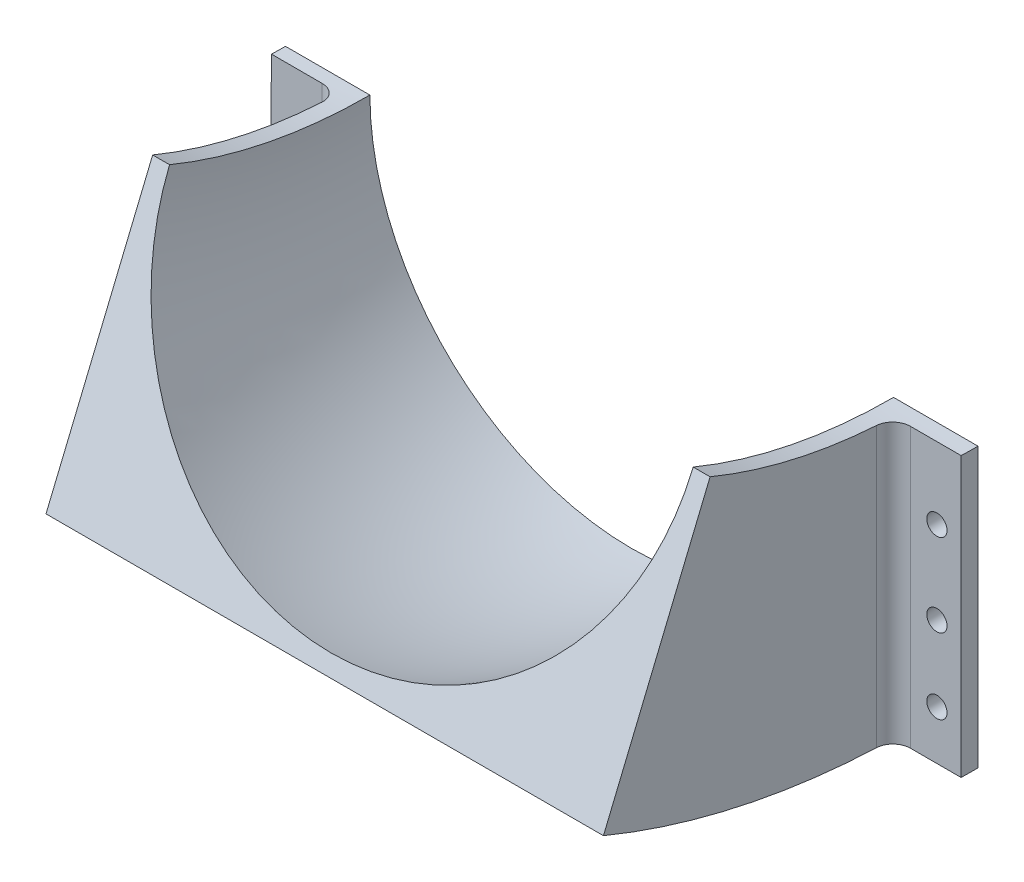
ISO-10303-21;
HEADER;
FILE_DESCRIPTION(('STEP AP214'),'2;1');
FILE_NAME('part.step','',(''),(''),'','','');
FILE_SCHEMA(('AUTOMOTIVE_DESIGN { 1 0 10303 214 1 1 1 1 }'));
ENDSEC;
DATA;
#1=APPLICATION_CONTEXT('core data for automotive mechanical design processes');
#2=APPLICATION_PROTOCOL_DEFINITION('international standard','automotive_design',2000,#1);
#3=PRODUCT_CONTEXT('',#1,'mechanical');
#4=PRODUCT('Part','Part','',(#3));
#5=PRODUCT_RELATED_PRODUCT_CATEGORY('part','',(#4));
#6=PRODUCT_DEFINITION_FORMATION('','',#4);
#7=PRODUCT_DEFINITION_CONTEXT('part definition',#1,'design');
#8=PRODUCT_DEFINITION('design','',#6,#7);
#9=PRODUCT_DEFINITION_SHAPE('','',#8);
#10=(LENGTH_UNIT() NAMED_UNIT(*) SI_UNIT(.MILLI.,.METRE.));
#11=(NAMED_UNIT(*) PLANE_ANGLE_UNIT() SI_UNIT($,.RADIAN.));
#12=(NAMED_UNIT(*) SI_UNIT($,.STERADIAN.) SOLID_ANGLE_UNIT());
#13=UNCERTAINTY_MEASURE_WITH_UNIT(LENGTH_MEASURE(1.E-05),#10,'distance_accuracy_value','');
#14=(GEOMETRIC_REPRESENTATION_CONTEXT(3) GLOBAL_UNCERTAINTY_ASSIGNED_CONTEXT((#13)) GLOBAL_UNIT_ASSIGNED_CONTEXT((#10,
#11,#12)) REPRESENTATION_CONTEXT('',''));
#15=CARTESIAN_POINT('',(0.,0.,0.));
#16=DIRECTION('',(0.,0.,1.));
#17=DIRECTION('',(1.,0.,0.));
#18=AXIS2_PLACEMENT_3D('',#15,#16,#17);
#19=CARTESIAN_POINT('',(52.4001999999994,-90.9328429874235,37.6656168305343));
#20=DIRECTION('',(-1.,0.,0.));
#21=DIRECTION('',(0.,0.,1.));
#22=AXIS2_PLACEMENT_3D('',#19,#20,#21);
#23=PLANE('',#22);
#24=DIRECTION('',(0.,-0.0105254294375171,-0.999944606133338));
#25=VECTOR('',#24,1.);
#26=CARTESIAN_POINT('',(52.4002000000002,-150.8252,0.));
#27=LINE('',#26,#25);
#28=CARTESIAN_POINT('',(52.4002000000002,-150.791781761536,3.17482412447336));
#29=VERTEX_POINT('',#28);
#30=CARTESIAN_POINT('',(52.4002,-150.8252,0.));
#31=VERTEX_POINT('',#30);
#32=EDGE_CURVE('E144',#29,#31,#27,.T.);
#33=ORIENTED_EDGE('',*,*,#32,.F.);
#34=CARTESIAN_POINT('',(52.4001999999987,4.33410518585465E-13,4.43591302579083E-13));
#35=DIRECTION('',(1.,0.,0.));
#36=DIRECTION('',(0.,0.,-1.));
#37=AXIS2_PLACEMENT_3D('',#34,#35,#36);
#38=CIRCLE('',#37,150.8252);
#39=EDGE_CURVE('E228',#29,#31,#38,.T.);
#40=ORIENTED_EDGE('',*,*,#39,.T.);
#41=EDGE_LOOP('',(#33,#40));
#42=FACE_BOUND('',#41,.T.);
#43=ADVANCED_FACE('F32',(#42),#23,.F.);
#44=CARTESIAN_POINT('',(52.4001999999994,-139.344315266921,57.7183052231515));
#45=VERTEX_POINT('',#44);
#46=CARTESIAN_POINT('',(52.4001999999999,-150.691475169063,6.34982412447336));
#47=VERTEX_POINT('',#46);
#48=EDGE_CURVE('E313',#45,#47,#38,.T.);
#49=ORIENTED_EDGE('',*,*,#48,.T.);
#50=DIRECTION('',(0.,-1.,0.));
#51=VECTOR('',#50,1.);
#52=CARTESIAN_POINT('',(52.4001999999997,-98.3737826698693,6.34982412447336));
#53=LINE('',#52,#51);
#54=CARTESIAN_POINT('',(52.4001999999999,-98.2199590642771,6.34982412447336));
#55=VERTEX_POINT('',#54);
#56=EDGE_CURVE('E171',#47,#55,#53,.F.);
#57=ORIENTED_EDGE('',*,*,#56,.T.);
#58=CARTESIAN_POINT('',(52.4001999999992,4.33410518585468E-13,4.43591302579087E-13));
#59=DIRECTION('',(1.,0.,0.));
#60=DIRECTION('',(0.,0.,-1.));
#61=AXIS2_PLACEMENT_3D('',#58,#59,#60);
#62=CIRCLE('',#61,98.4250000000005);
#63=CARTESIAN_POINT('',(52.4001999999996,-90.9328429874235,37.6656168305343));
#64=VERTEX_POINT('',#63);
#65=EDGE_CURVE('E158',#64,#55,#62,.T.);
#66=ORIENTED_EDGE('',*,*,#65,.F.);
#67=DIRECTION('',(0.,0.923879532511286,-0.382683432365091));
#68=VECTOR('',#67,1.);
#69=CARTESIAN_POINT('',(52.4001999999996,-90.9328429874235,37.6656168305343));
#70=LINE('',#69,#68);
#71=EDGE_CURVE('E271',#45,#64,#70,.T.);
#72=ORIENTED_EDGE('',*,*,#71,.F.);
#73=EDGE_LOOP('',(#49,#57,#66,#72));
#74=FACE_BOUND('',#73,.T.);
#75=ADVANCED_FACE('F212',(#74),#23,.F.);
#76=CARTESIAN_POINT('',(-52.4002000000006,-90.9328429874233,37.6656168305338));
#77=DIRECTION('',(1.,0.,0.));
#78=DIRECTION('',(0.,0.,-1.));
#79=AXIS2_PLACEMENT_3D('',#76,#77,#78);
#80=PLANE('',#79);
#81=CARTESIAN_POINT('',(-52.4002000000008,-4.33410518585482E-13,-4.43591302579101E-13));
#82=DIRECTION('',(1.,0.,0.));
#83=DIRECTION('',(0.,0.,-1.));
#84=AXIS2_PLACEMENT_3D('',#81,#82,#83);
#85=CIRCLE('',#84,98.4249999999996);
#86=CARTESIAN_POINT('',(-52.4002000000004,-90.9328429874233,37.6656168305338));
#87=VERTEX_POINT('',#86);
#88=CARTESIAN_POINT('',(-52.4002,-98.2541375915305,5.79698810975075));
#89=VERTEX_POINT('',#88);
#90=EDGE_CURVE('E279',#87,#89,#85,.T.);
#91=ORIENTED_EDGE('',*,*,#90,.T.);
#92=DIRECTION('',(0.,0.999944606133338,-0.0105254294375171));
#93=VECTOR('',#92,1.);
#94=CARTESIAN_POINT('',(-52.4001999999998,-150.758363523072,6.34964824894671));
#95=LINE('',#94,#93);
#96=CARTESIAN_POINT('',(-52.4002,-150.691512229022,6.34894457138896));
#97=VERTEX_POINT('',#96);
#98=EDGE_CURVE('E166',#89,#97,#95,.F.);
#99=ORIENTED_EDGE('',*,*,#98,.T.);
#100=CARTESIAN_POINT('',(-52.4002000000012,-4.33410518585485E-13,-4.43591302579104E-13));
#101=DIRECTION('',(1.,0.,0.));
#102=DIRECTION('',(0.,0.,-1.));
#103=AXIS2_PLACEMENT_3D('',#100,#101,#102);
#104=CIRCLE('',#103,150.8252);
#105=CARTESIAN_POINT('',(-52.4002000000006,-139.344315266921,57.7183052231511));
#106=VERTEX_POINT('',#105);
#107=EDGE_CURVE('E287',#106,#97,#104,.T.);
#108=ORIENTED_EDGE('',*,*,#107,.F.);
#109=DIRECTION('',(0.,-0.923879532511286,0.382683432365091));
#110=VECTOR('',#109,1.);
#111=CARTESIAN_POINT('',(-52.4002000000004,-90.9328429874233,37.6656168305338));
#112=LINE('',#111,#110);
#113=EDGE_CURVE('E265',#87,#106,#112,.T.);
#114=ORIENTED_EDGE('',*,*,#113,.F.);
#115=EDGE_LOOP('',(#91,#99,#108,#114));
#116=FACE_BOUND('',#115,.T.);
#117=ADVANCED_FACE('F209',(#116),#80,.F.);
#118=CARTESIAN_POINT('',(-8.08335934173403E-13,0.,0.));
#119=DIRECTION('',(1.,0.,0.));
#120=DIRECTION('',(0.,0.,-1.));
#121=AXIS2_PLACEMENT_3D('',#118,#119,#120);
#122=TOROIDAL_SURFACE('',#121,98.425,49.2252);
#123=CARTESIAN_POINT('',(49.2251999999992,4.07149580716741E-13,4.16713497042302E-13));
#124=DIRECTION('',(1.,0.,0.));
#125=DIRECTION('',(0.,0.,-1.));
#126=AXIS2_PLACEMENT_3D('',#123,#124,#125);
#127=CIRCLE('',#126,98.4250000000004);
#128=CARTESIAN_POINT('',(49.2251999999996,-90.9328429874235,37.6656168305342));
#129=VERTEX_POINT('',#128);
#130=CARTESIAN_POINT('',(49.2252,-98.425,0.));
#131=VERTEX_POINT('',#130);
#132=EDGE_CURVE('E167',#129,#131,#127,.T.);
#133=ORIENTED_EDGE('',*,*,#132,.T.);
#134=CARTESIAN_POINT('',(0.,-98.425,0.));
#135=DIRECTION('',(0.,0.,-1.));
#136=DIRECTION('',(1.,0.,0.));
#137=AXIS2_PLACEMENT_3D('',#134,#135,#136);
#138=CIRCLE('',#137,49.2252);
#139=CARTESIAN_POINT('',(-49.2252,-98.425,0.));
#140=VERTEX_POINT('',#139);
#141=EDGE_CURVE('E249',#131,#140,#138,.T.);
#142=ORIENTED_EDGE('',*,*,#141,.T.);
#143=CARTESIAN_POINT('',(-49.2252000000008,-4.07149580716755E-13,-4.16713497042316E-13));
#144=DIRECTION('',(1.,0.,0.));
#145=DIRECTION('',(0.,0.,-1.));
#146=AXIS2_PLACEMENT_3D('',#143,#144,#145);
#147=CIRCLE('',#146,98.4249999999996);
#148=CARTESIAN_POINT('',(-49.2252000000004,-90.9328429874233,37.6656168305339));
#149=VERTEX_POINT('',#148);
#150=EDGE_CURVE('E277',#149,#140,#147,.T.);
#151=ORIENTED_EDGE('',*,*,#150,.F.);
#152=CARTESIAN_POINT('',(-3.78124512131155E-13,-90.9328429874234,37.665616830534));
#153=DIRECTION('',(0.,-0.382683432365091,-0.923879532511286));
#154=DIRECTION('',(1.,0.,0.));
#155=AXIS2_PLACEMENT_3D('',#152,#153,#154);
#156=CIRCLE('',#155,49.2252);
#157=EDGE_CURVE('E259',#129,#149,#156,.T.);
#158=ORIENTED_EDGE('',*,*,#157,.F.);
#159=EDGE_LOOP('',(#133,#142,#151,#158));
#160=FACE_BOUND('',#159,.T.);
#161=ADVANCED_FACE('F200',(#160),#122,.F.);
#162=CARTESIAN_POINT('',(-38.048924234204,-3.14708798515383E-13,-3.22101287071114E-13));
#163=DIRECTION('',(1.,0.,0.));
#164=DIRECTION('',(0.,0.,-1.));
#165=AXIS2_PLACEMENT_3D('',#162,#163,#164);
#166=CYLINDRICAL_SURFACE('',#165,98.4250000000004);
#167=ORIENTED_EDGE('',*,*,#65,.T.);
#168=CARTESIAN_POINT('',(52.4001999999997,-98.2199590642771,6.34982412447336));
#169=CARTESIAN_POINT('',(52.400191499142,-98.2257329040307,6.26053191378045));
#170=CARTESIAN_POINT('',(52.4039668015081,-98.2313824049752,6.17123535133689));
#171=CARTESIAN_POINT('',(52.4190234059374,-98.2424007766746,5.9932630885812));
#172=CARTESIAN_POINT('',(52.4303044292155,-98.2477696578446,5.90458736533286));
#173=CARTESIAN_POINT('',(52.4603005356074,-98.2581916778865,5.72854031558916));
#174=CARTESIAN_POINT('',(52.4790104891243,-98.2632450318461,5.64116813211565));
#175=CARTESIAN_POINT('',(52.5237170018949,-98.2730159174548,5.46831574734498));
#176=CARTESIAN_POINT('',(52.5497134504481,-98.2777334542045,5.38283551732551));
#177=CARTESIAN_POINT('',(52.6384322243503,-98.2913605041457,5.13005134228879));
#178=CARTESIAN_POINT('',(52.7118946055312,-98.2997481088688,4.96634183073719));
#179=CARTESIAN_POINT('',(52.8852766000394,-98.3150474677564,4.65367170948396));
#180=CARTESIAN_POINT('',(52.9851908324749,-98.3219595215647,4.50470810859559));
#181=CARTESIAN_POINT('',(53.2085332261674,-98.3343403186156,4.22582642067313));
#182=CARTESIAN_POINT('',(53.3319295896855,-98.3398109900532,4.09588299414776));
#183=CARTESIAN_POINT('',(53.5988501278835,-98.349410607911,3.85852504230684));
#184=CARTESIAN_POINT('',(53.7423782846394,-98.3535392883477,3.75111498461524));
#185=CARTESIAN_POINT('',(54.045327855363,-98.360570312984,3.56199541466849));
#186=CARTESIAN_POINT('',(54.2047370067462,-98.3634735944477,3.48026627226839));
#187=CARTESIAN_POINT('',(54.534992993334,-98.3681748548551,3.34476112101959));
#188=CARTESIAN_POINT('',(54.7058329830998,-98.3699734888701,3.29096854832432));
#189=CARTESIAN_POINT('',(54.9939716379102,-98.3721117482247,3.22628403907093));
#190=CARTESIAN_POINT('',(55.109453615333,-98.3727404928343,3.20699819506851));
#191=CARTESIAN_POINT('',(55.3416742245253,-98.373574671572,3.18126998092252));
#192=CARTESIAN_POINT('',(55.4584108338399,-98.3737807069024,3.17480937039736));
#193=CARTESIAN_POINT('',(55.5751999999997,-98.3737826698692,3.17482412447339));
#194=B_SPLINE_CURVE_WITH_KNOTS('',3,(#168,#169,#170,#171,#172,#173,#174,#175,#176,#177,#178,
#179,#180,#181,#182,#183,#184,#185,#186,#187,#188,#189,#190,#191,#192,#193),.UNSPECIFIED.,.F.,
.F.,(4,2,2,2,2,2,2,2,2,2,2,2,4),(0.,0.268349604683924,0.536689242612577,0.804843916213137,
1.07299451608083,1.60910883059716,2.1451141712846,2.68039879309688,3.21578944410519,
3.75076984853317,4.2854326950333,4.63601806405564,4.9861044631751),.UNSPECIFIED.);
#195=CARTESIAN_POINT('',(55.5751999999997,-98.3737826698692,3.17482412447339));
#196=VERTEX_POINT('',#195);
#197=EDGE_CURVE('E42',#55,#196,#194,.T.);
#198=ORIENTED_EDGE('',*,*,#197,.T.);
#199=DIRECTION('',(-1.,0.,0.));
#200=VECTOR('',#199,1.);
#201=CARTESIAN_POINT('',(65.1001999999997,-98.3737826698691,3.17482412447347));
#202=LINE('',#201,#200);
#203=CARTESIAN_POINT('',(65.1001999999997,-98.3737826698691,3.17482412447347));
#204=VERTEX_POINT('',#203);
#205=EDGE_CURVE('E128',#204,#196,#202,.T.);
#206=ORIENTED_EDGE('',*,*,#205,.F.);
#207=CARTESIAN_POINT('',(65.1001999999989,5.38454270060376E-13,5.51102524726224E-13));
#208=DIRECTION('',(-1.,0.,0.));
#209=DIRECTION('',(0.,0.,-1.));
#210=AXIS2_PLACEMENT_3D('',#207,#208,#209);
#211=CIRCLE('',#210,98.4250000000005);
#212=CARTESIAN_POINT('',(65.1001999999998,-98.4249999999999,1.07511222147137E-13));
#213=VERTEX_POINT('',#212);
#214=EDGE_CURVE('E135',#213,#204,#211,.T.);
#215=ORIENTED_EDGE('',*,*,#214,.F.);
#216=DIRECTION('',(-1.,0.,0.));
#217=VECTOR('',#216,1.);
#218=CARTESIAN_POINT('',(49.2252,-98.425,0.));
#219=LINE('',#218,#217);
#220=EDGE_CURVE('E257',#213,#131,#219,.T.);
#221=ORIENTED_EDGE('',*,*,#220,.T.);
#222=ORIENTED_EDGE('',*,*,#132,.F.);
#223=DIRECTION('',(-1.,0.,0.));
#224=VECTOR('',#223,1.);
#225=CARTESIAN_POINT('',(49.2251999999996,-90.9328429874235,37.6656168305342));
#226=LINE('',#225,#224);
#227=EDGE_CURVE('E274',#64,#129,#226,.T.);
#228=ORIENTED_EDGE('',*,*,#227,.F.);
#229=EDGE_LOOP('',(#167,#198,#206,#215,#221,#222,#228));
#230=FACE_BOUND('',#229,.T.);
#231=ADVANCED_FACE('F147',(#230),#166,.F.);
#232=CARTESIAN_POINT('',(-38.048924234204,-3.14708798515383E-13,-3.22101287071114E-13));
#233=DIRECTION('',(1.,0.,0.));
#234=DIRECTION('',(0.,0.,-1.));
#235=AXIS2_PLACEMENT_3D('',#232,#233,#234);
#236=CYLINDRICAL_SURFACE('',#235,150.8252);
#237=ORIENTED_EDGE('',*,*,#107,.T.);
#238=CARTESIAN_POINT('',(-52.4001999999998,-150.691512229022,6.34894457138896));
#239=CARTESIAN_POINT('',(-52.4001914501951,-150.695273322151,6.25969374569486));
#240=CARTESIAN_POINT('',(-52.4039662225406,-150.698953433331,6.17044345448695));
#241=CARTESIAN_POINT('',(-52.4190175793959,-150.706130833941,5.99257418114129));
#242=CARTESIAN_POINT('',(-52.4302938259575,-150.709628131598,5.90395517074554));
#243=CARTESIAN_POINT('',(-52.4602721942552,-150.716416872689,5.72803577455502));
#244=CARTESIAN_POINT('',(-52.4789688049355,-150.719708466801,5.64073445995302));
#245=CARTESIAN_POINT('',(-52.5236374448059,-150.726072953555,5.46803162953788));
#246=CARTESIAN_POINT('',(-52.54960937903,-150.729145849051,5.38263008894237));
#247=CARTESIAN_POINT('',(-52.6382309583886,-150.738022078061,5.13009772180996));
#248=CARTESIAN_POINT('',(-52.7115982047064,-150.743485601129,4.96657011748419));
#249=CARTESIAN_POINT('',(-52.8847173002034,-150.753452224235,4.65425636689482));
#250=CARTESIAN_POINT('',(-52.984464330481,-150.757955499414,4.50546753505674));
#251=CARTESIAN_POINT('',(-53.2075111852032,-150.766027102767,4.22675645845941));
#252=CARTESIAN_POINT('',(-53.3308033020946,-150.769595735995,4.09682806411128));
#253=CARTESIAN_POINT('',(-53.5974872147325,-150.77585845353,3.85948250153951));
#254=CARTESIAN_POINT('',(-53.7408829590143,-150.77855236569,3.75206976596224));
#255=CARTESIAN_POINT('',(-54.0436749126128,-150.783142902094,3.56283060148352));
#256=CARTESIAN_POINT('',(-54.2030722156421,-150.785039471794,3.48100592311064));
#257=CARTESIAN_POINT('',(-54.5333134910483,-150.788111203075,3.34531172938945));
#258=CARTESIAN_POINT('',(-54.704150690599,-150.789286787388,3.29142583564878));
#259=CARTESIAN_POINT('',(-54.9925605363774,-150.790686499879,3.22652749378016));
#260=CARTESIAN_POINT('',(-55.108319286784,-150.791098636654,3.20715048278115));
#261=CARTESIAN_POINT('',(-55.3411025217112,-150.791645424796,3.18130047143857));
#262=CARTESIAN_POINT('',(-55.4581249752487,-150.791780469401,3.17480918466213));
#263=CARTESIAN_POINT('',(-55.5751999999998,-150.791781761536,3.17482412447334));
#264=B_SPLINE_CURVE_WITH_KNOTS('',3,(#238,#239,#240,#241,#242,#243,#244,#245,#246,#247,#248,
#249,#250,#251,#252,#253,#254,#255,#256,#257,#258,#259,#260,#261,#262,#263),.UNSPECIFIED.,.F.,
.F.,(4,2,2,2,2,2,2,2,2,2,2,2,4),(0.,0.267903201146717,0.535794333830029,0.803486876733843,
1.07117592556573,1.60634640907749,2.14141919828247,2.6763171291607,3.21132026642892,
3.74635999629544,4.28108571726295,4.63252763386337,4.98347045344798),.UNSPECIFIED.);
#265=CARTESIAN_POINT('',(-55.5751999999998,-150.791781761536,3.17482412447329));
#266=VERTEX_POINT('',#265);
#267=EDGE_CURVE('E179',#97,#266,#264,.T.);
#268=ORIENTED_EDGE('',*,*,#267,.T.);
#269=DIRECTION('',(1.,0.,0.));
#270=VECTOR('',#269,1.);
#271=CARTESIAN_POINT('',(-65.1001999999998,-150.791781761536,3.1748241244732));
#272=LINE('',#271,#270);
#273=CARTESIAN_POINT('',(-65.1001999999998,-150.791781761536,3.1748241244732));
#274=VERTEX_POINT('',#273);
#275=EDGE_CURVE('E253',#274,#266,#272,.T.);
#276=ORIENTED_EDGE('',*,*,#275,.F.);
#277=CARTESIAN_POINT('',(-65.100200000001,-5.38454270060393E-13,-5.51102524726241E-13));
#278=DIRECTION('',(-1.,0.,0.));
#279=DIRECTION('',(0.,0.,1.));
#280=AXIS2_PLACEMENT_3D('',#277,#278,#279);
#281=CIRCLE('',#280,150.8252);
#282=CARTESIAN_POINT('',(-65.1001999999997,-150.8252,-1.07511222147137E-13));
#283=VERTEX_POINT('',#282);
#284=EDGE_CURVE('E244',#283,#274,#281,.T.);
#285=ORIENTED_EDGE('',*,*,#284,.F.);
#286=DIRECTION('',(1.,0.,0.));
#287=VECTOR('',#286,1.);
#288=CARTESIAN_POINT('',(-52.4002,-150.8252,0.));
#289=LINE('',#288,#287);
#290=EDGE_CURVE('E255',#283,#31,#289,.T.);
#291=ORIENTED_EDGE('',*,*,#290,.T.);
#292=ORIENTED_EDGE('',*,*,#39,.F.);
#293=DIRECTION('',(1.,0.,0.));
#294=VECTOR('',#293,1.);
#295=CARTESIAN_POINT('',(52.4002000000002,-150.791781761536,3.17482412447336));
#296=LINE('',#295,#294);
#297=CARTESIAN_POINT('',(55.5752000000002,-150.791781761536,3.17482412443434));
#298=VERTEX_POINT('',#297);
#299=EDGE_CURVE('E11',#29,#298,#296,.T.);
#300=ORIENTED_EDGE('',*,*,#299,.T.);
#301=CARTESIAN_POINT('',(55.5752000000002,-150.791781761536,3.17482412443434));
#302=CARTESIAN_POINT('',(55.485917043363,-150.791781351172,3.17481555833256));
#303=CARTESIAN_POINT('',(55.3966381415676,-150.791702455263,3.17859013097483));
#304=CARTESIAN_POINT('',(55.2187191264406,-150.791384790412,3.1936392701111));
#305=CARTESIAN_POINT('',(55.1300789826557,-150.791146029142,3.20491347663076));
#306=CARTESIAN_POINT('',(54.9541261103739,-150.79050597455,3.23488426089773));
#307=CARTESIAN_POINT('',(54.8668124276117,-150.790104804429,3.25357521215903));
#308=CARTESIAN_POINT('',(54.6940916269787,-150.789134698458,3.29822767119434));
#309=CARTESIAN_POINT('',(54.6086844858378,-150.788565764656,3.32418909017733));
#310=CARTESIAN_POINT('',(54.3561469611928,-150.786595922619,3.41276892541786));
#311=CARTESIAN_POINT('',(54.1926288501881,-150.784931728003,3.48609518587032));
#312=CARTESIAN_POINT('',(53.8803469932779,-150.78083227981,3.65909894540448));
#313=CARTESIAN_POINT('',(53.7315806579487,-150.778397161871,3.75877180848814));
#314=CARTESIAN_POINT('',(53.4528683807535,-150.77267544063,3.98166955103092));
#315=CARTESIAN_POINT('',(53.3229226574943,-150.769388827439,4.10489470401804));
#316=CARTESIAN_POINT('',(53.0855461157473,-150.761896437461,4.37141502630175));
#317=CARTESIAN_POINT('',(52.9781196441559,-150.757690483533,4.51471406157511));
#318=CARTESIAN_POINT('',(52.788814642149,-150.748324185724,4.81732421570694));
#319=CARTESIAN_POINT('',(52.7069454122285,-150.743163495492,4.97664113578997));
#320=CARTESIAN_POINT('',(52.5711520952511,-150.731904818726,5.30669515486532));
#321=CARTESIAN_POINT('',(52.5172120202801,-150.725807371033,5.47742565685891));
#322=CARTESIAN_POINT('',(52.4521302552678,-150.714988678732,5.76596294543435));
#323=CARTESIAN_POINT('',(52.4326671295541,-150.710506885222,5.88197041915622));
#324=CARTESIAN_POINT('',(52.4067036797597,-150.701222513216,6.11524595977525));
#325=CARTESIAN_POINT('',(52.4001848818006,-150.696420402011,6.23251198965341));
#326=CARTESIAN_POINT('',(52.4002000000001,-150.691475169062,6.34982412447334));
#327=B_SPLINE_CURVE_WITH_KNOTS('',3,(#301,#302,#303,#304,#305,#306,#307,#308,#309,#310,#311,
#312,#313,#314,#315,#316,#317,#318,#319,#320,#321,#322,#323,#324,#325,#326),.UNSPECIFIED.,.F.,
.F.,(4,2,2,2,2,2,2,2,2,2,2,2,4),(0.,0.267761762426867,0.5355106735058,0.803056852220594,
1.0705997636542,1.60547032474867,2.14024683158765,2.67502954951008,3.20991540180249,
3.74499567725507,4.27976930892042,4.63223914824504,4.98420558727224),.UNSPECIFIED.);
#328=EDGE_CURVE('E48',#298,#47,#327,.T.);
#329=ORIENTED_EDGE('',*,*,#328,.T.);
#330=ORIENTED_EDGE('',*,*,#48,.F.);
#331=DIRECTION('',(1.,0.,0.));
#332=VECTOR('',#331,1.);
#333=CARTESIAN_POINT('',(-52.4002000000006,-139.344315266921,57.7183052231511));
#334=LINE('',#333,#332);
#335=EDGE_CURVE('E268',#106,#45,#334,.T.);
#336=ORIENTED_EDGE('',*,*,#335,.F.);
#337=EDGE_LOOP('',(#237,#268,#276,#285,#291,#292,#300,#329,#330,#336));
#338=FACE_BOUND('',#337,.T.);
#339=ADVANCED_FACE('F199',(#338),#236,.T.);
#340=CARTESIAN_POINT('',(-38.048924234204,-3.14708798515383E-13,-3.22101287071114E-13));
#341=DIRECTION('',(1.,0.,0.));
#342=DIRECTION('',(0.,0.,-1.));
#343=AXIS2_PLACEMENT_3D('',#340,#341,#342);
#344=CYLINDRICAL_SURFACE('',#343,98.4249999999996);
#345=DIRECTION('',(-1.,0.,0.));
#346=VECTOR('',#345,1.);
#347=CARTESIAN_POINT('',(-49.2252000000004,-90.9328429874233,37.6656168305339));
#348=LINE('',#347,#346);
#349=EDGE_CURVE('E262',#149,#87,#348,.T.);
#350=ORIENTED_EDGE('',*,*,#349,.F.);
#351=ORIENTED_EDGE('',*,*,#150,.T.);
#352=DIRECTION('',(-1.,0.,0.));
#353=VECTOR('',#352,1.);
#354=CARTESIAN_POINT('',(-49.2252,-98.425,0.));
#355=LINE('',#354,#353);
#356=CARTESIAN_POINT('',(-65.1002000000002,-98.4250000000002,-1.0751122214714E-13));
#357=VERTEX_POINT('',#356);
#358=EDGE_CURVE('E252',#140,#357,#355,.T.);
#359=ORIENTED_EDGE('',*,*,#358,.T.);
#360=CARTESIAN_POINT('',(-65.100200000001,-5.38454270060393E-13,-5.51102524726241E-13));
#361=DIRECTION('',(1.,0.,0.));
#362=DIRECTION('',(0.,0.,1.));
#363=AXIS2_PLACEMENT_3D('',#360,#361,#362);
#364=CIRCLE('',#363,98.4249999999996);
#365=CARTESIAN_POINT('',(-65.1002000000002,-98.3900361965768,2.62324269489838));
#366=VERTEX_POINT('',#365);
#367=EDGE_CURVE('E149',#366,#357,#364,.T.);
#368=ORIENTED_EDGE('',*,*,#367,.F.);
#369=DIRECTION('',(1.,0.,0.));
#370=VECTOR('',#369,1.);
#371=CARTESIAN_POINT('',(-65.1002000000002,-98.3900361965768,2.62324269489838));
#372=LINE('',#371,#370);
#373=CARTESIAN_POINT('',(-55.5752000000002,-98.3900361965767,2.62324269489847));
#374=VERTEX_POINT('',#373);
#375=EDGE_CURVE('E248',#366,#374,#372,.T.);
#376=ORIENTED_EDGE('',*,*,#375,.T.);
#377=CARTESIAN_POINT('',(-55.5752000000002,-98.3900361965767,2.62324269489847));
#378=CARTESIAN_POINT('',(-55.4859123771997,-98.3900355196741,2.62323412602519));
#379=CARTESIAN_POINT('',(-55.3966288054885,-98.3899357770267,2.62700824703008));
#380=CARTESIAN_POINT('',(-55.2187004128874,-98.3895333413955,2.64205556781));
#381=CARTESIAN_POINT('',(-55.1300555617202,-98.3892306580965,2.65332840972687));
#382=CARTESIAN_POINT('',(-54.9540928854215,-98.3884178292835,2.6832955974797));
#383=CARTESIAN_POINT('',(-54.8667741114011,-98.3879078401428,2.70198434914915));
#384=CARTESIAN_POINT('',(-54.6940431691779,-98.3866715277945,2.74663149105039));
#385=CARTESIAN_POINT('',(-54.608630977608,-98.3859452072398,2.77258979213268));
#386=CARTESIAN_POINT('',(-54.3560781715008,-98.3834231043855,2.86115888802087));
#387=CARTESIAN_POINT('',(-54.1925499793612,-98.3812838742839,2.93447609137746));
#388=CARTESIAN_POINT('',(-53.8802497979416,-98.375971518066,3.10745663735926));
#389=CARTESIAN_POINT('',(-53.7314752054389,-98.3727985747698,3.20711532070455));
#390=CARTESIAN_POINT('',(-53.4527608719421,-98.3652801442164,3.42996852434601));
#391=CARTESIAN_POINT('',(-53.3228199246698,-98.3609347321058,3.55316153611682));
#392=CARTESIAN_POINT('',(-53.0854559136571,-98.3509481255232,3.81960202945383));
#393=CARTESIAN_POINT('',(-52.9780371315149,-98.345306685095,3.96285331560058));
#394=CARTESIAN_POINT('',(-52.7887682417506,-98.3326526476974,4.2653185762416));
#395=CARTESIAN_POINT('',(-52.7069226873349,-98.325639806917,4.42453538667253));
#396=CARTESIAN_POINT('',(-52.5711665040791,-98.3102430031215,4.75435842938005));
#397=CARTESIAN_POINT('',(-52.5172400092448,-98.3018598224226,4.92495813055812));
#398=CARTESIAN_POINT('',(-52.4521506736217,-98.2869018768278,5.21332347375871));
#399=CARTESIAN_POINT('',(-52.4326791613906,-98.2806832289001,5.3293008048995));
#400=CARTESIAN_POINT('',(-52.4067054836039,-98.2677614511909,5.56250315386022));
#401=CARTESIAN_POINT('',(-52.4001847888031,-98.2610590278256,5.67972614752543));
#402=CARTESIAN_POINT('',(-52.4002000000002,-98.2541375915306,5.79698810975076));
#403=B_SPLINE_CURVE_WITH_KNOTS('',3,(#377,#378,#379,#380,#381,#382,#383,#384,#385,#386,#387,
#388,#389,#390,#391,#392,#393,#394,#395,#396,#397,#398,#399,#400,#401,#402),.UNSPECIFIED.,.F.,
.F.,(4,2,2,2,2,2,2,2,2,2,2,2,4),(0.,0.267775769060212,0.535538760092173,0.803100147828946,
1.07065825449268,1.60556004808323,2.1403672915078,2.67514026585377,3.21001481174491,
3.74498453562017,4.27964990937671,4.6322707044271,4.98438662651641),.UNSPECIFIED.);
#404=EDGE_CURVE('E173',#374,#89,#403,.T.);
#405=ORIENTED_EDGE('',*,*,#404,.T.);
#406=ORIENTED_EDGE('',*,*,#90,.F.);
#407=EDGE_LOOP('',(#350,#351,#359,#368,#376,#405,#406));
#408=FACE_BOUND('',#407,.T.);
#409=ADVANCED_FACE('F185',(#408),#344,.F.);
#410=CARTESIAN_POINT('',(-3.78124512131155E-13,-90.9328429874234,37.665616830534));
#411=DIRECTION('',(0.,0.382683432365091,0.923879532511286));
#412=DIRECTION('',(1.,0.,0.));
#413=AXIS2_PLACEMENT_3D('',#410,#411,#412);
#414=PLANE('',#413);
#415=ORIENTED_EDGE('',*,*,#157,.T.);
#416=ORIENTED_EDGE('',*,*,#349,.T.);
#417=ORIENTED_EDGE('',*,*,#113,.T.);
#418=ORIENTED_EDGE('',*,*,#335,.T.);
#419=ORIENTED_EDGE('',*,*,#71,.T.);
#420=ORIENTED_EDGE('',*,*,#227,.T.);
#421=EDGE_LOOP('',(#415,#416,#417,#418,#419,#420));
#422=FACE_BOUND('',#421,.T.);
#423=ADVANCED_FACE('F311',(#422),#414,.T.);
#424=CARTESIAN_POINT('',(0.,-98.425,0.));
#425=DIRECTION('',(0.,0.,1.));
#426=DIRECTION('',(1.,0.,0.));
#427=AXIS2_PLACEMENT_3D('',#424,#425,#426);
#428=PLANE('',#427);
#429=CARTESIAN_POINT('',(-60.7540190766187,-127.476625796266,0.));
#430=DIRECTION('',(0.,0.,1.));
#431=DIRECTION('',(-8.12512136115866E-13,1.,0.));
#432=AXIS2_PLACEMENT_3D('',#429,#430,#431);
#433=ELLIPSE('',#432,1.90510553116177,1.905);
#434=CARTESIAN_POINT('',(-60.7540190766202,-125.571520265105,0.));
#435=VERTEX_POINT('',#434);
#436=EDGE_CURVE('E352',#435,#435,#433,.T.);
#437=ORIENTED_EDGE('',*,*,#436,.T.);
#438=EDGE_LOOP('',(#437));
#439=FACE_BOUND('',#438,.T.);
#440=CARTESIAN_POINT('',(-60.7540190766187,-112.510793894045,0.));
#441=DIRECTION('',(0.,0.,1.));
#442=DIRECTION('',(-8.12512136115866E-13,1.,0.));
#443=AXIS2_PLACEMENT_3D('',#440,#441,#442);
#444=ELLIPSE('',#443,1.90510553116177,1.905);
#445=CARTESIAN_POINT('',(-60.7540190766202,-110.605688362883,0.));
#446=VERTEX_POINT('',#445);
#447=EDGE_CURVE('E346',#446,#446,#444,.T.);
#448=ORIENTED_EDGE('',*,*,#447,.T.);
#449=EDGE_LOOP('',(#448));
#450=FACE_BOUND('',#449,.T.);
#451=CARTESIAN_POINT('',(-60.7540190766187,-141.55484402201,0.));
#452=DIRECTION('',(0.,0.,1.));
#453=DIRECTION('',(-8.12512136115866E-13,1.,0.));
#454=AXIS2_PLACEMENT_3D('',#451,#452,#453);
#455=ELLIPSE('',#454,1.90510553116177,1.905);
#456=CARTESIAN_POINT('',(-60.7540190766202,-139.649738490849,0.));
#457=VERTEX_POINT('',#456);
#458=EDGE_CURVE('E340',#457,#457,#455,.T.);
#459=ORIENTED_EDGE('',*,*,#458,.T.);
#460=EDGE_LOOP('',(#459));
#461=FACE_BOUND('',#460,.T.);
#462=CARTESIAN_POINT('',(60.5501864239795,-127.4445,0.));
#463=DIRECTION('',(0.,0.,1.));
#464=DIRECTION('',(1.,0.,0.));
#465=AXIS2_PLACEMENT_3D('',#462,#463,#464);
#466=CIRCLE('',#465,1.905);
#467=CARTESIAN_POINT('',(62.4551864239795,-127.4445,0.));
#468=VERTEX_POINT('',#467);
#469=EDGE_CURVE('E334',#468,#468,#466,.T.);
#470=ORIENTED_EDGE('',*,*,#469,.T.);
#471=EDGE_LOOP('',(#470));
#472=FACE_BOUND('',#471,.T.);
#473=CARTESIAN_POINT('',(60.5501864239795,-141.566764632731,0.));
#474=DIRECTION('',(0.,0.,1.));
#475=DIRECTION('',(1.,0.,0.));
#476=AXIS2_PLACEMENT_3D('',#473,#474,#475);
#477=CIRCLE('',#476,1.905);
#478=CARTESIAN_POINT('',(62.4551864239795,-141.566764632731,0.));
#479=VERTEX_POINT('',#478);
#480=EDGE_CURVE('E328',#479,#479,#477,.T.);
#481=ORIENTED_EDGE('',*,*,#480,.T.);
#482=EDGE_LOOP('',(#481));
#483=FACE_BOUND('',#482,.T.);
#484=CARTESIAN_POINT('',(60.5501864239795,-111.886000657208,0.));
#485=DIRECTION('',(0.,0.,1.));
#486=DIRECTION('',(1.,0.,0.));
#487=AXIS2_PLACEMENT_3D('',#484,#485,#486);
#488=CIRCLE('',#487,1.905);
#489=CARTESIAN_POINT('',(62.4551864239795,-111.886000657208,0.));
#490=VERTEX_POINT('',#489);
#491=EDGE_CURVE('E233',#490,#490,#488,.T.);
#492=ORIENTED_EDGE('',*,*,#491,.T.);
#493=EDGE_LOOP('',(#492));
#494=FACE_BOUND('',#493,.T.);
#495=ORIENTED_EDGE('',*,*,#141,.F.);
#496=ORIENTED_EDGE('',*,*,#220,.F.);
#497=DIRECTION('',(0.,1.,0.));
#498=VECTOR('',#497,1.);
#499=CARTESIAN_POINT('',(65.1001999999998,-98.4249999999999,1.07511222147137E-13));
#500=LINE('',#499,#498);
#501=CARTESIAN_POINT('',(65.1002000000002,-150.8252,1.0751122214714E-13));
#502=VERTEX_POINT('',#501);
#503=EDGE_CURVE('E141',#502,#213,#500,.T.);
#504=ORIENTED_EDGE('',*,*,#503,.F.);
#505=DIRECTION('',(-1.,0.,0.));
#506=VECTOR('',#505,1.);
#507=CARTESIAN_POINT('',(65.1002000000002,-150.8252,1.0751122214714E-13));
#508=LINE('',#507,#506);
#509=EDGE_CURVE('E154',#502,#31,#508,.T.);
#510=ORIENTED_EDGE('',*,*,#509,.T.);
#511=ORIENTED_EDGE('',*,*,#290,.F.);
#512=DIRECTION('',(0.,-1.,0.));
#513=VECTOR('',#512,1.);
#514=CARTESIAN_POINT('',(-65.1002000000002,-98.4250000000002,-1.0751122214714E-13));
#515=LINE('',#514,#513);
#516=EDGE_CURVE('E152',#357,#283,#515,.T.);
#517=ORIENTED_EDGE('',*,*,#516,.F.);
#518=ORIENTED_EDGE('',*,*,#358,.F.);
#519=EDGE_LOOP('',(#495,#496,#504,#510,#511,#517,#518));
#520=FACE_BOUND('',#519,.T.);
#521=ADVANCED_FACE('F321',(#439,#450,#461,#472,#483,#494,#520),#428,.F.);
#522=CARTESIAN_POINT('',(-65.1001999999998,-150.791781761536,3.17482412447325));
#523=DIRECTION('',(0.,-0.0105254294375171,-0.999944606133338));
#524=DIRECTION('',(0.,0.999944606133338,-0.0105254294375171));
#525=AXIS2_PLACEMENT_3D('',#522,#523,#524);
#526=PLANE('',#525);
#527=CARTESIAN_POINT('',(-60.7540190766187,-127.44579422177,2.92908396747684));
#528=DIRECTION('',(0.,0.0105254294375171,0.999944606133338));
#529=DIRECTION('',(0.,-0.999944606133338,0.0105254294375171));
#530=AXIS2_PLACEMENT_3D('',#527,#528,#529);
#531=CIRCLE('',#530,1.905);
#532=CARTESIAN_POINT('',(-60.7540190766187,-129.350688696454,2.94913491055531));
#533=VERTEX_POINT('',#532);
#534=EDGE_CURVE('E355',#533,#533,#531,.T.);
#535=ORIENTED_EDGE('',*,*,#534,.F.);
#536=EDGE_LOOP('',(#535));
#537=FACE_BOUND('',#536,.T.);
#538=CARTESIAN_POINT('',(-60.7540190766187,-112.48162030422,2.77157088555827));
#539=DIRECTION('',(0.,0.0105254294375171,0.999944606133338));
#540=DIRECTION('',(0.,-0.999944606133338,0.0105254294375171));
#541=AXIS2_PLACEMENT_3D('',#538,#539,#540);
#542=CIRCLE('',#541,1.905);
#543=CARTESIAN_POINT('',(-60.7540190766187,-114.386514778904,2.79162182863674));
#544=VERTEX_POINT('',#543);
#545=EDGE_CURVE('E349',#544,#544,#542,.T.);
#546=ORIENTED_EDGE('',*,*,#545,.F.);
#547=EDGE_LOOP('',(#546));
#548=FACE_BOUND('',#547,.T.);
#549=CARTESIAN_POINT('',(-60.7540190766187,-141.522452796826,3.0772550517939));
#550=DIRECTION('',(0.,0.0105254294375171,0.999944606133338));
#551=DIRECTION('',(0.,-0.999944606133338,0.0105254294375171));
#552=AXIS2_PLACEMENT_3D('',#549,#550,#551);
#553=CIRCLE('',#552,1.905);
#554=CARTESIAN_POINT('',(-60.7540190766187,-143.42734727151,3.09730599487237));
#555=VERTEX_POINT('',#554);
#556=EDGE_CURVE('E343',#555,#555,#553,.T.);
#557=ORIENTED_EDGE('',*,*,#556,.F.);
#558=EDGE_LOOP('',(#557));
#559=FACE_BOUND('',#558,.T.);
#560=ORIENTED_EDGE('',*,*,#275,.T.);
#561=DIRECTION('',(0.,0.999944606133338,-0.0105254294375171));
#562=VECTOR('',#561,1.);
#563=CARTESIAN_POINT('',(-55.5752000000002,-98.3900361965767,2.62324269489847));
#564=LINE('',#563,#562);
#565=EDGE_CURVE('E163',#266,#374,#564,.T.);
#566=ORIENTED_EDGE('',*,*,#565,.T.);
#567=ORIENTED_EDGE('',*,*,#375,.F.);
#568=DIRECTION('',(0.,0.999944606133338,-0.0105254294375171));
#569=VECTOR('',#568,1.);
#570=CARTESIAN_POINT('',(-65.1001999999998,-150.791781761536,3.17482412447325));
#571=LINE('',#570,#569);
#572=EDGE_CURVE('E246',#274,#366,#571,.T.);
#573=ORIENTED_EDGE('',*,*,#572,.F.);
#574=EDGE_LOOP('',(#560,#566,#567,#573));
#575=FACE_BOUND('',#574,.T.);
#576=ADVANCED_FACE('F300',(#537,#548,#559,#575),#526,.F.);
#577=CARTESIAN_POINT('',(-65.100200000001,-5.38454270060393E-13,-5.51102524726241E-13));
#578=DIRECTION('',(-1.,0.,0.));
#579=DIRECTION('',(0.,0.,1.));
#580=AXIS2_PLACEMENT_3D('',#577,#578,#579);
#581=PLANE('',#580);
#582=ORIENTED_EDGE('',*,*,#367,.T.);
#583=ORIENTED_EDGE('',*,*,#516,.T.);
#584=ORIENTED_EDGE('',*,*,#284,.T.);
#585=ORIENTED_EDGE('',*,*,#572,.T.);
#586=EDGE_LOOP('',(#582,#583,#584,#585));
#587=FACE_BOUND('',#586,.T.);
#588=ADVANCED_FACE('F363',(#587),#581,.T.);
#589=CARTESIAN_POINT('',(65.1002000000002,-150.791781761536,3.17482412447347));
#590=DIRECTION('',(0.,0.,-1.));
#591=DIRECTION('',(-1.,0.,0.));
#592=AXIS2_PLACEMENT_3D('',#589,#590,#591);
#593=PLANE('',#592);
#594=CARTESIAN_POINT('',(60.5501864239795,-127.4445,3.17482412447291));
#595=DIRECTION('',(0.,0.,1.));
#596=DIRECTION('',(1.,0.,0.));
#597=AXIS2_PLACEMENT_3D('',#594,#595,#596);
#598=CIRCLE('',#597,1.905);
#599=CARTESIAN_POINT('',(62.4551864239795,-127.4445,3.17482412447291));
#600=VERTEX_POINT('',#599);
#601=EDGE_CURVE('E337',#600,#600,#598,.T.);
#602=ORIENTED_EDGE('',*,*,#601,.F.);
#603=EDGE_LOOP('',(#602));
#604=FACE_BOUND('',#603,.T.);
#605=CARTESIAN_POINT('',(60.5501864239795,-141.566764632731,3.17482412447291));
#606=DIRECTION('',(0.,0.,1.));
#607=DIRECTION('',(1.,0.,0.));
#608=AXIS2_PLACEMENT_3D('',#605,#606,#607);
#609=CIRCLE('',#608,1.905);
#610=CARTESIAN_POINT('',(62.4551864239795,-141.566764632731,3.17482412447291));
#611=VERTEX_POINT('',#610);
#612=EDGE_CURVE('E331',#611,#611,#609,.T.);
#613=ORIENTED_EDGE('',*,*,#612,.F.);
#614=EDGE_LOOP('',(#613));
#615=FACE_BOUND('',#614,.T.);
#616=CARTESIAN_POINT('',(60.5501864239795,-111.886000657208,3.17482412447291));
#617=DIRECTION('',(0.,0.,1.));
#618=DIRECTION('',(1.,0.,0.));
#619=AXIS2_PLACEMENT_3D('',#616,#617,#618);
#620=CIRCLE('',#619,1.905);
#621=CARTESIAN_POINT('',(62.4551864239795,-111.886000657208,3.17482412447291));
#622=VERTEX_POINT('',#621);
#623=EDGE_CURVE('E236',#622,#622,#620,.T.);
#624=ORIENTED_EDGE('',*,*,#623,.F.);
#625=EDGE_LOOP('',(#624));
#626=FACE_BOUND('',#625,.T.);
#627=ORIENTED_EDGE('',*,*,#205,.T.);
#628=DIRECTION('',(0.,-1.,0.));
#629=VECTOR('',#628,1.);
#630=CARTESIAN_POINT('',(55.5752000000002,-150.791781761536,3.17482412447339));
#631=LINE('',#630,#629);
#632=EDGE_CURVE('E169',#196,#298,#631,.T.);
#633=ORIENTED_EDGE('',*,*,#632,.T.);
#634=DIRECTION('',(-1.,0.,0.));
#635=VECTOR('',#634,1.);
#636=CARTESIAN_POINT('',(65.1002000000002,-150.791781761536,3.17482412447347));
#637=LINE('',#636,#635);
#638=CARTESIAN_POINT('',(65.1002000000002,-150.791781761536,3.17482412447347));
#639=VERTEX_POINT('',#638);
#640=EDGE_CURVE('E131',#639,#298,#637,.T.);
#641=ORIENTED_EDGE('',*,*,#640,.F.);
#642=DIRECTION('',(0.,-1.,0.));
#643=VECTOR('',#642,1.);
#644=CARTESIAN_POINT('',(65.1002000000002,-150.791781761536,3.17482412447347));
#645=LINE('',#644,#643);
#646=EDGE_CURVE('E123',#204,#639,#645,.T.);
#647=ORIENTED_EDGE('',*,*,#646,.F.);
#648=EDGE_LOOP('',(#627,#633,#641,#647));
#649=FACE_BOUND('',#648,.T.);
#650=ADVANCED_FACE('F125',(#604,#615,#626,#649),#593,.F.);
#651=CARTESIAN_POINT('',(65.1002000000002,-150.8252,1.0751122214714E-13));
#652=DIRECTION('',(0.,0.999944606133338,-0.0105254294375171));
#653=DIRECTION('',(0.,0.0105254294375171,0.999944606133338));
#654=AXIS2_PLACEMENT_3D('',#651,#652,#653);
#655=PLANE('',#654);
#656=ORIENTED_EDGE('',*,*,#32,.T.);
#657=ORIENTED_EDGE('',*,*,#509,.F.);
#658=DIRECTION('',(0.,-0.0105254294375171,-0.999944606133338));
#659=VECTOR('',#658,1.);
#660=CARTESIAN_POINT('',(65.1002000000002,-150.8252,1.0751122214714E-13));
#661=LINE('',#660,#659);
#662=EDGE_CURVE('E134',#639,#502,#661,.T.);
#663=ORIENTED_EDGE('',*,*,#662,.F.);
#664=ORIENTED_EDGE('',*,*,#640,.T.);
#665=ORIENTED_EDGE('',*,*,#299,.F.);
#666=EDGE_LOOP('',(#656,#657,#663,#664,#665));
#667=FACE_BOUND('',#666,.T.);
#668=ADVANCED_FACE('F324',(#667),#655,.F.);
#669=CARTESIAN_POINT('',(65.1001999999989,5.38454270060376E-13,5.51102524726224E-13));
#670=DIRECTION('',(1.,0.,0.));
#671=DIRECTION('',(0.,0.,-1.));
#672=AXIS2_PLACEMENT_3D('',#669,#670,#671);
#673=PLANE('',#672);
#674=ORIENTED_EDGE('',*,*,#214,.T.);
#675=ORIENTED_EDGE('',*,*,#646,.T.);
#676=ORIENTED_EDGE('',*,*,#662,.T.);
#677=ORIENTED_EDGE('',*,*,#503,.T.);
#678=EDGE_LOOP('',(#674,#675,#676,#677));
#679=FACE_BOUND('',#678,.T.);
#680=ADVANCED_FACE('F139',(#679),#673,.T.);
#681=CARTESIAN_POINT('',(60.5501864239795,-111.886000657208,-0.000175875527087289));
#682=DIRECTION('',(0.,0.,1.));
#683=DIRECTION('',(1.,0.,0.));
#684=AXIS2_PLACEMENT_3D('',#681,#682,#683);
#685=CYLINDRICAL_SURFACE('',#684,1.905);
#686=ORIENTED_EDGE('',*,*,#623,.T.);
#687=EDGE_LOOP('',(#686));
#688=FACE_BOUND('',#687,.T.);
#689=ORIENTED_EDGE('',*,*,#491,.F.);
#690=EDGE_LOOP('',(#689));
#691=FACE_BOUND('',#690,.T.);
#692=ADVANCED_FACE('F387',(#688,#691),#685,.F.);
#693=CARTESIAN_POINT('',(60.5501864239795,-141.566764632731,-0.000175875527087289));
#694=DIRECTION('',(0.,0.,1.));
#695=DIRECTION('',(1.,0.,0.));
#696=AXIS2_PLACEMENT_3D('',#693,#694,#695);
#697=CYLINDRICAL_SURFACE('',#696,1.905);
#698=ORIENTED_EDGE('',*,*,#612,.T.);
#699=EDGE_LOOP('',(#698));
#700=FACE_BOUND('',#699,.T.);
#701=ORIENTED_EDGE('',*,*,#480,.F.);
#702=EDGE_LOOP('',(#701));
#703=FACE_BOUND('',#702,.T.);
#704=ADVANCED_FACE('F389',(#700,#703),#697,.F.);
#705=CARTESIAN_POINT('',(60.5501864239795,-127.4445,-0.000175875527087289));
#706=DIRECTION('',(0.,0.,1.));
#707=DIRECTION('',(1.,0.,0.));
#708=AXIS2_PLACEMENT_3D('',#705,#706,#707);
#709=CYLINDRICAL_SURFACE('',#708,1.905);
#710=ORIENTED_EDGE('',*,*,#601,.T.);
#711=EDGE_LOOP('',(#710));
#712=FACE_BOUND('',#711,.T.);
#713=ORIENTED_EDGE('',*,*,#469,.F.);
#714=EDGE_LOOP('',(#713));
#715=FACE_BOUND('',#714,.T.);
#716=ADVANCED_FACE('F373',(#712,#715),#709,.F.);
#717=CARTESIAN_POINT('',(-60.7540190766187,-141.55587103529,-0.0975690726794454));
#718=DIRECTION('',(0.,0.0105254294375171,0.999944606133338));
#719=DIRECTION('',(0.,-0.999944606133338,0.0105254294375171));
#720=AXIS2_PLACEMENT_3D('',#717,#718,#719);
#721=CYLINDRICAL_SURFACE('',#720,1.905);
#722=ORIENTED_EDGE('',*,*,#556,.T.);
#723=EDGE_LOOP('',(#722));
#724=FACE_BOUND('',#723,.T.);
#725=ORIENTED_EDGE('',*,*,#458,.F.);
#726=EDGE_LOOP('',(#725));
#727=FACE_BOUND('',#726,.T.);
#728=ADVANCED_FACE('F369',(#724,#727),#721,.F.);
#729=CARTESIAN_POINT('',(-60.7540190766187,-112.515038542684,-0.403253238915073));
#730=DIRECTION('',(0.,0.0105254294375171,0.999944606133338));
#731=DIRECTION('',(0.,-0.999944606133338,0.0105254294375171));
#732=AXIS2_PLACEMENT_3D('',#729,#730,#731);
#733=CYLINDRICAL_SURFACE('',#732,1.905);
#734=ORIENTED_EDGE('',*,*,#545,.T.);
#735=EDGE_LOOP('',(#734));
#736=FACE_BOUND('',#735,.T.);
#737=ORIENTED_EDGE('',*,*,#447,.F.);
#738=EDGE_LOOP('',(#737));
#739=FACE_BOUND('',#738,.T.);
#740=ADVANCED_FACE('F372',(#736,#739),#733,.F.);
#741=CARTESIAN_POINT('',(-60.7540190766187,-127.479212460234,-0.24574015699651));
#742=DIRECTION('',(0.,0.0105254294375171,0.999944606133338));
#743=DIRECTION('',(0.,-0.999944606133338,0.0105254294375171));
#744=AXIS2_PLACEMENT_3D('',#741,#742,#743);
#745=CYLINDRICAL_SURFACE('',#744,1.905);
#746=ORIENTED_EDGE('',*,*,#534,.T.);
#747=EDGE_LOOP('',(#746));
#748=FACE_BOUND('',#747,.T.);
#749=ORIENTED_EDGE('',*,*,#436,.F.);
#750=EDGE_LOOP('',(#749));
#751=FACE_BOUND('',#750,.T.);
#752=ADVANCED_FACE('F193',(#748,#751),#745,.F.);
#753=CARTESIAN_POINT('',(-55.5751999999998,-150.758363523072,6.34964824894668));
#754=DIRECTION('',(0.,-0.999944606133338,0.0105254294375171));
#755=DIRECTION('',(0.,-0.0105254294375171,-0.999944606133338));
#756=AXIS2_PLACEMENT_3D('',#753,#754,#755);
#757=CYLINDRICAL_SURFACE('',#756,3.175);
#758=ORIENTED_EDGE('',*,*,#267,.F.);
#759=ORIENTED_EDGE('',*,*,#98,.F.);
#760=ORIENTED_EDGE('',*,*,#404,.F.);
#761=ORIENTED_EDGE('',*,*,#565,.F.);
#762=EDGE_LOOP('',(#758,#759,#760,#761));
#763=FACE_BOUND('',#762,.T.);
#764=ADVANCED_FACE('F189',(#763),#757,.F.);
#765=CARTESIAN_POINT('',(55.5752000000001,-150.791781761536,6.34982412447339));
#766=DIRECTION('',(0.,1.,0.));
#767=DIRECTION('',(-1.,0.,0.));
#768=AXIS2_PLACEMENT_3D('',#765,#766,#767);
#769=CYLINDRICAL_SURFACE('',#768,3.175);
#770=ORIENTED_EDGE('',*,*,#197,.F.);
#771=ORIENTED_EDGE('',*,*,#56,.F.);
#772=ORIENTED_EDGE('',*,*,#328,.F.);
#773=ORIENTED_EDGE('',*,*,#632,.F.);
#774=EDGE_LOOP('',(#770,#771,#772,#773));
#775=FACE_BOUND('',#774,.T.);
#776=ADVANCED_FACE('F34',(#775),#769,.F.);
#777=CLOSED_SHELL('',(#43,#75,#117,#161,#231,#339,#409,#423,#521,#576,#588,#650,#668,#680,#692,
#704,#716,#728,#740,#752,#764,#776));
#778=MANIFOLD_SOLID_BREP('B2',#777);
#779=ADVANCED_BREP_SHAPE_REPRESENTATION('',(#18,#778),#14);
#780=SHAPE_DEFINITION_REPRESENTATION(#9,#779);
ENDSEC;
END-ISO-10303-21;
